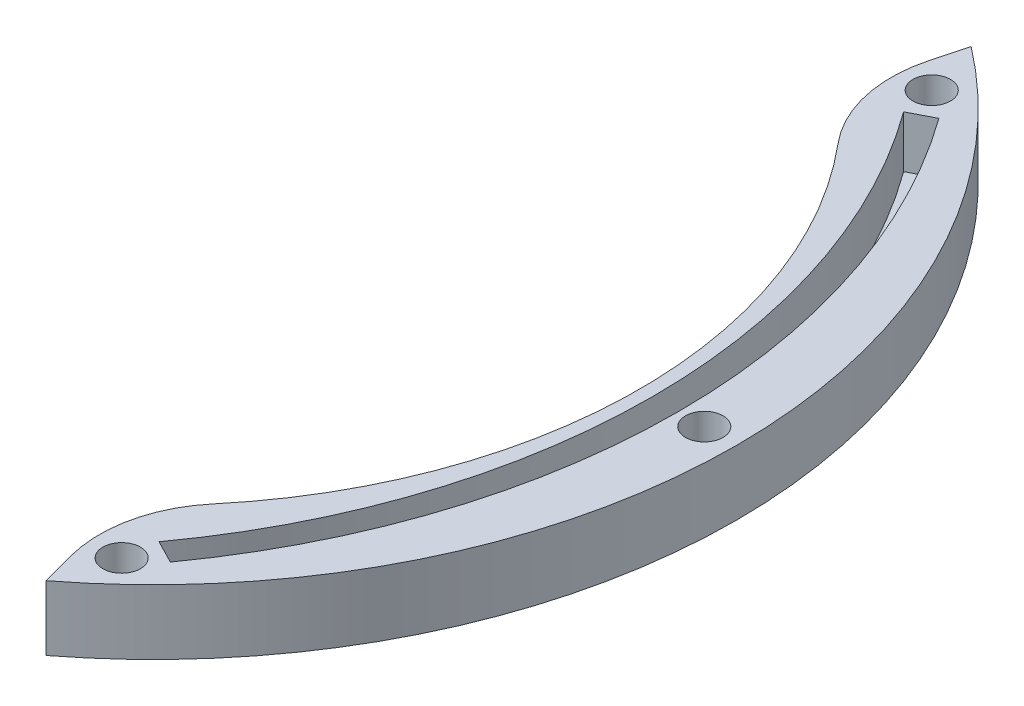
ISO-10303-21;
HEADER;
FILE_DESCRIPTION(('STEP AP214'),'2;1');
FILE_NAME('part.step','',(''),(''),'','','');
FILE_SCHEMA(('AUTOMOTIVE_DESIGN { 1 0 10303 214 1 1 1 1 }'));
ENDSEC;
DATA;
#1=APPLICATION_CONTEXT('core data for automotive mechanical design processes');
#2=APPLICATION_PROTOCOL_DEFINITION('international standard','automotive_design',2000,#1);
#3=PRODUCT_CONTEXT('',#1,'mechanical');
#4=PRODUCT('Part','Part','',(#3));
#5=PRODUCT_RELATED_PRODUCT_CATEGORY('part','',(#4));
#6=PRODUCT_DEFINITION_FORMATION('','',#4);
#7=PRODUCT_DEFINITION_CONTEXT('part definition',#1,'design');
#8=PRODUCT_DEFINITION('design','',#6,#7);
#9=PRODUCT_DEFINITION_SHAPE('','',#8);
#10=(LENGTH_UNIT() NAMED_UNIT(*) SI_UNIT(.MILLI.,.METRE.));
#11=(NAMED_UNIT(*) PLANE_ANGLE_UNIT() SI_UNIT($,.RADIAN.));
#12=(NAMED_UNIT(*) SI_UNIT($,.STERADIAN.) SOLID_ANGLE_UNIT());
#13=UNCERTAINTY_MEASURE_WITH_UNIT(LENGTH_MEASURE(1.E-05),#10,'distance_accuracy_value','');
#14=(GEOMETRIC_REPRESENTATION_CONTEXT(3) GLOBAL_UNCERTAINTY_ASSIGNED_CONTEXT((#13)) GLOBAL_UNIT_ASSIGNED_CONTEXT((#10,
#11,#12)) REPRESENTATION_CONTEXT('',''));
#15=CARTESIAN_POINT('',(0.,0.,0.));
#16=DIRECTION('',(0.,0.,1.));
#17=DIRECTION('',(1.,0.,0.));
#18=AXIS2_PLACEMENT_3D('',#15,#16,#17);
#19=CARTESIAN_POINT('',(0.,5.,0.));
#20=DIRECTION('',(0.,-1.,0.));
#21=DIRECTION('',(0.,0.,-1.));
#22=AXIS2_PLACEMENT_3D('',#19,#20,#21);
#23=CYLINDRICAL_SURFACE('',#22,45.);
#24=CARTESIAN_POINT('',(0.,0.,0.));
#25=DIRECTION('',(0.,1.,0.));
#26=DIRECTION('',(0.,0.,-1.));
#27=AXIS2_PLACEMENT_3D('',#24,#25,#26);
#28=CIRCLE('',#27,45.);
#29=CARTESIAN_POINT('',(27.3954375763557,0.,35.7));
#30=VERTEX_POINT('',#29);
#31=CARTESIAN_POINT('',(27.3954375763557,0.,-35.7));
#32=VERTEX_POINT('',#31);
#33=EDGE_CURVE('E164',#30,#32,#28,.T.);
#34=ORIENTED_EDGE('',*,*,#33,.T.);
#35=DIRECTION('',(0.,-1.,0.));
#36=VECTOR('',#35,1.);
#37=CARTESIAN_POINT('',(27.3954375763557,5.,-35.7));
#38=LINE('',#37,#36);
#39=CARTESIAN_POINT('',(27.3954375763557,5.,-35.7));
#40=VERTEX_POINT('',#39);
#41=EDGE_CURVE('E199',#40,#32,#38,.T.);
#42=ORIENTED_EDGE('',*,*,#41,.F.);
#43=CARTESIAN_POINT('',(0.,5.,0.));
#44=DIRECTION('',(0.,1.,0.));
#45=DIRECTION('',(0.,0.,-1.));
#46=AXIS2_PLACEMENT_3D('',#43,#44,#45);
#47=CIRCLE('',#46,45.);
#48=CARTESIAN_POINT('',(27.3954375763557,5.,35.7));
#49=VERTEX_POINT('',#48);
#50=EDGE_CURVE('E179',#49,#40,#47,.T.);
#51=ORIENTED_EDGE('',*,*,#50,.F.);
#52=DIRECTION('',(0.,-1.,0.));
#53=VECTOR('',#52,1.);
#54=CARTESIAN_POINT('',(27.3954375763557,5.,35.7));
#55=LINE('',#54,#53);
#56=EDGE_CURVE('E189',#49,#30,#55,.T.);
#57=ORIENTED_EDGE('',*,*,#56,.T.);
#58=EDGE_LOOP('',(#34,#42,#51,#57));
#59=FACE_BOUND('',#58,.T.);
#60=ADVANCED_FACE('F40',(#59),#23,.T.);
#61=CARTESIAN_POINT('',(25.2569128106269,5.,-27.7189169210558));
#62=DIRECTION('',(0.965925826289069,0.,0.258819045102518));
#63=DIRECTION('',(0.258819045102518,0.,-0.965925826289069));
#64=AXIS2_PLACEMENT_3D('',#61,#62,#63);
#65=PLANE('',#64);
#66=DIRECTION('',(-0.258819045102518,0.,0.965925826289069));
#67=VECTOR('',#66,1.);
#68=CARTESIAN_POINT('',(25.2569128106269,0.,-27.7189169210558));
#69=LINE('',#68,#67);
#70=CARTESIAN_POINT('',(26.7099905064169,0.,-33.1418767090893));
#71=VERTEX_POINT('',#70);
#72=EDGE_CURVE('E192',#32,#71,#69,.T.);
#73=ORIENTED_EDGE('',*,*,#72,.T.);
#74=DIRECTION('',(0.,-1.,0.));
#75=VECTOR('',#74,1.);
#76=CARTESIAN_POINT('',(26.7099905064169,5.,-33.1418767090893));
#77=LINE('',#76,#75);
#78=CARTESIAN_POINT('',(26.7099905064169,5.,-33.1418767090893));
#79=VERTEX_POINT('',#78);
#80=EDGE_CURVE('E11',#71,#79,#77,.F.);
#81=ORIENTED_EDGE('',*,*,#80,.T.);
#82=DIRECTION('',(-0.258819045102518,0.,0.965925826289069));
#83=VECTOR('',#82,1.);
#84=CARTESIAN_POINT('',(25.2569128106269,5.,-27.7189169210558));
#85=LINE('',#84,#83);
#86=EDGE_CURVE('E182',#40,#79,#85,.T.);
#87=ORIENTED_EDGE('',*,*,#86,.F.);
#88=ORIENTED_EDGE('',*,*,#41,.T.);
#89=EDGE_LOOP('',(#73,#81,#87,#88));
#90=FACE_BOUND('',#89,.T.);
#91=ADVANCED_FACE('F234',(#90),#65,.F.);
#92=CARTESIAN_POINT('',(0.,5.,0.));
#93=DIRECTION('',(0.,-1.,0.));
#94=DIRECTION('',(0.,0.,-1.));
#95=AXIS2_PLACEMENT_3D('',#92,#93,#94);
#96=CYLINDRICAL_SURFACE('',#95,37.5);
#97=CARTESIAN_POINT('',(0.,0.,0.));
#98=DIRECTION('',(0.,-1.,0.));
#99=DIRECTION('',(0.,0.,-1.));
#100=AXIS2_PLACEMENT_3D('',#97,#98,#99);
#101=CIRCLE('',#100,37.5);
#102=CARTESIAN_POINT('',(28.7125648178744,0.,-24.1213312563664));
#103=VERTEX_POINT('',#102);
#104=CARTESIAN_POINT('',(28.7125648178744,0.,24.1213312563664));
#105=VERTEX_POINT('',#104);
#106=EDGE_CURVE('E194',#103,#105,#101,.T.);
#107=ORIENTED_EDGE('',*,*,#106,.T.);
#108=DIRECTION('',(0.,-1.,0.));
#109=VECTOR('',#108,1.);
#110=CARTESIAN_POINT('',(28.7125648178744,5.,24.1213312563664));
#111=LINE('',#110,#109);
#112=CARTESIAN_POINT('',(28.7125648178744,5.,24.1213312563664));
#113=VERTEX_POINT('',#112);
#114=EDGE_CURVE('E61',#105,#113,#111,.F.);
#115=ORIENTED_EDGE('',*,*,#114,.T.);
#116=CARTESIAN_POINT('',(0.,5.,0.));
#117=DIRECTION('',(0.,-1.,0.));
#118=DIRECTION('',(0.,0.,-1.));
#119=AXIS2_PLACEMENT_3D('',#116,#117,#118);
#120=CIRCLE('',#119,37.5);
#121=CARTESIAN_POINT('',(28.7125648178744,5.,-24.1213312563664));
#122=VERTEX_POINT('',#121);
#123=EDGE_CURVE('E185',#122,#113,#120,.T.);
#124=ORIENTED_EDGE('',*,*,#123,.F.);
#125=DIRECTION('',(0.,-1.,0.));
#126=VECTOR('',#125,1.);
#127=CARTESIAN_POINT('',(28.7125648178744,5.,-24.1213312563664));
#128=LINE('',#127,#126);
#129=EDGE_CURVE('E209',#122,#103,#128,.T.);
#130=ORIENTED_EDGE('',*,*,#129,.T.);
#131=EDGE_LOOP('',(#107,#115,#124,#130));
#132=FACE_BOUND('',#131,.T.);
#133=ADVANCED_FACE('F230',(#132),#96,.F.);
#134=CARTESIAN_POINT('',(27.3954375763557,5.,35.7));
#135=DIRECTION('',(0.965925826289069,0.,-0.258819045102518));
#136=DIRECTION('',(-0.258819045102518,0.,-0.965925826289069));
#137=AXIS2_PLACEMENT_3D('',#134,#135,#136);
#138=PLANE('',#137);
#139=DIRECTION('',(0.258819045102518,0.,0.965925826289069));
#140=VECTOR('',#139,1.);
#141=CARTESIAN_POINT('',(27.3954375763557,5.,35.7));
#142=LINE('',#141,#140);
#143=CARTESIAN_POINT('',(26.7099905064169,5.,33.1418767090893));
#144=VERTEX_POINT('',#143);
#145=EDGE_CURVE('E187',#144,#49,#142,.T.);
#146=ORIENTED_EDGE('',*,*,#145,.F.);
#147=DIRECTION('',(0.,-1.,0.));
#148=VECTOR('',#147,1.);
#149=CARTESIAN_POINT('',(26.7099905064169,5.,33.1418767090893));
#150=LINE('',#149,#148);
#151=CARTESIAN_POINT('',(26.7099905064169,0.,33.1418767090893));
#152=VERTEX_POINT('',#151);
#153=EDGE_CURVE('E202',#144,#152,#150,.T.);
#154=ORIENTED_EDGE('',*,*,#153,.T.);
#155=DIRECTION('',(0.258819045102518,0.,0.965925826289069));
#156=VECTOR('',#155,1.);
#157=CARTESIAN_POINT('',(27.3954375763557,0.,35.7));
#158=LINE('',#157,#156);
#159=EDGE_CURVE('E183',#152,#30,#158,.T.);
#160=ORIENTED_EDGE('',*,*,#159,.T.);
#161=ORIENTED_EDGE('',*,*,#56,.F.);
#162=EDGE_LOOP('',(#146,#154,#160,#161));
#163=FACE_BOUND('',#162,.T.);
#164=ADVANCED_FACE('F222',(#163),#138,.F.);
#165=CARTESIAN_POINT('',(0.,5.,0.));
#166=DIRECTION('',(0.,-1.,0.));
#167=DIRECTION('',(0.,0.,-1.));
#168=AXIS2_PLACEMENT_3D('',#165,#166,#167);
#169=PLANE('',#168);
#170=DIRECTION('',(0.889788358318186,0.,0.456373396903706));
#171=VECTOR('',#170,1.);
#172=CARTESIAN_POINT('',(29.1523991042336,5.,28.7341081209373));
#173=LINE('',#172,#171);
#174=CARTESIAN_POINT('',(29.1523991042336,5.,28.7341081209373));
#175=VERTEX_POINT('',#174);
#176=CARTESIAN_POINT('',(30.9527362807552,5.,29.6575029767366));
#177=VERTEX_POINT('',#176);
#178=EDGE_CURVE('E151',#175,#177,#173,.T.);
#179=ORIENTED_EDGE('',*,*,#178,.F.);
#180=CARTESIAN_POINT('',(-10.3374802224702,5.,1.11823851350236E-06));
#181=DIRECTION('',(0.,-1.,0.));
#182=DIRECTION('',(0.,0.,-1.));
#183=AXIS2_PLACEMENT_3D('',#180,#181,#182);
#184=CIRCLE('',#183,48.8374802224702);
#185=CARTESIAN_POINT('',(29.1523979191704,5.,-28.7341075131171));
#186=VERTEX_POINT('',#185);
#187=EDGE_CURVE('E125',#186,#175,#184,.T.);
#188=ORIENTED_EDGE('',*,*,#187,.F.);
#189=DIRECTION('',(-0.889788358318186,0.,0.456373396903706));
#190=VECTOR('',#189,1.);
#191=CARTESIAN_POINT('',(29.1523979191704,5.,-28.7341075131171));
#192=LINE('',#191,#190);
#193=CARTESIAN_POINT('',(30.9527351068354,5.,-29.6575023746319));
#194=VERTEX_POINT('',#193);
#195=EDGE_CURVE('E142',#194,#186,#192,.T.);
#196=ORIENTED_EDGE('',*,*,#195,.F.);
#197=CARTESIAN_POINT('',(-10.3374802224702,5.,1.11823851350236E-06));
#198=DIRECTION('',(0.,1.,0.));
#199=DIRECTION('',(0.,0.,1.));
#200=AXIS2_PLACEMENT_3D('',#197,#198,#199);
#201=CIRCLE('',#200,50.8374802224702);
#202=EDGE_CURVE('E145',#177,#194,#201,.T.);
#203=ORIENTED_EDGE('',*,*,#202,.F.);
#204=EDGE_LOOP('',(#179,#188,#196,#203));
#205=FACE_BOUND('',#204,.T.);
#206=CARTESIAN_POINT('',(42.5,5.,0.));
#207=DIRECTION('',(0.,1.,0.));
#208=DIRECTION('',(0.,0.,1.));
#209=AXIS2_PLACEMENT_3D('',#206,#207,#208);
#210=CIRCLE('',#209,1.45);
#211=CARTESIAN_POINT('',(42.5,5.,1.45));
#212=VERTEX_POINT('',#211);
#213=EDGE_CURVE('E165',#212,#212,#210,.T.);
#214=ORIENTED_EDGE('',*,*,#213,.F.);
#215=EDGE_LOOP('',(#214));
#216=FACE_BOUND('',#215,.T.);
#217=CARTESIAN_POINT('',(28.7938366328269,5.,-31.2596380651164));
#218=DIRECTION('',(0.,1.,0.));
#219=DIRECTION('',(0.,0.,1.));
#220=AXIS2_PLACEMENT_3D('',#217,#218,#219);
#221=CIRCLE('',#220,1.45);
#222=CARTESIAN_POINT('',(28.7938366328269,5.,-29.8096380651164));
#223=VERTEX_POINT('',#222);
#224=EDGE_CURVE('E168',#223,#223,#221,.T.);
#225=ORIENTED_EDGE('',*,*,#224,.F.);
#226=EDGE_LOOP('',(#225));
#227=FACE_BOUND('',#226,.T.);
#228=CARTESIAN_POINT('',(28.7938366328269,5.,31.2596380651164));
#229=DIRECTION('',(0.,1.,0.));
#230=DIRECTION('',(0.,0.,-1.));
#231=AXIS2_PLACEMENT_3D('',#228,#229,#230);
#232=CIRCLE('',#231,1.45);
#233=CARTESIAN_POINT('',(28.7938366328269,5.,29.8096380651164));
#234=VERTEX_POINT('',#233);
#235=EDGE_CURVE('E174',#234,#234,#232,.T.);
#236=ORIENTED_EDGE('',*,*,#235,.F.);
#237=EDGE_LOOP('',(#236));
#238=FACE_BOUND('',#237,.T.);
#239=ORIENTED_EDGE('',*,*,#123,.T.);
#240=CARTESIAN_POINT('',(36.3692487693076,5.,30.5536862580641));
#241=DIRECTION('',(0.,-1.,0.));
#242=DIRECTION('',(0.,0.,-1.));
#243=AXIS2_PLACEMENT_3D('',#240,#241,#242);
#244=CIRCLE('',#243,10.);
#245=EDGE_CURVE('E48',#113,#144,#244,.F.);
#246=ORIENTED_EDGE('',*,*,#245,.T.);
#247=ORIENTED_EDGE('',*,*,#145,.T.);
#248=ORIENTED_EDGE('',*,*,#50,.T.);
#249=ORIENTED_EDGE('',*,*,#86,.T.);
#250=CARTESIAN_POINT('',(36.3692487693076,5.,-30.5536862580641));
#251=DIRECTION('',(0.,-1.,0.));
#252=DIRECTION('',(0.,0.,-1.));
#253=AXIS2_PLACEMENT_3D('',#250,#251,#252);
#254=CIRCLE('',#253,10.);
#255=EDGE_CURVE('E213',#79,#122,#254,.F.);
#256=ORIENTED_EDGE('',*,*,#255,.T.);
#257=EDGE_LOOP('',(#239,#246,#247,#248,#249,#256));
#258=FACE_BOUND('',#257,.T.);
#259=ADVANCED_FACE('F217',(#205,#216,#227,#238,#258),#169,.F.);
#260=CARTESIAN_POINT('',(0.,0.,0.));
#261=DIRECTION('',(0.,-1.,0.));
#262=DIRECTION('',(0.,0.,-1.));
#263=AXIS2_PLACEMENT_3D('',#260,#261,#262);
#264=PLANE('',#263);
#265=CARTESIAN_POINT('',(42.5,0.,0.));
#266=DIRECTION('',(0.,1.,0.));
#267=DIRECTION('',(0.,0.,1.));
#268=AXIS2_PLACEMENT_3D('',#265,#266,#267);
#269=CIRCLE('',#268,1.45);
#270=CARTESIAN_POINT('',(42.5,0.,1.45));
#271=VERTEX_POINT('',#270);
#272=EDGE_CURVE('E161',#271,#271,#269,.T.);
#273=ORIENTED_EDGE('',*,*,#272,.T.);
#274=EDGE_LOOP('',(#273));
#275=FACE_BOUND('',#274,.T.);
#276=CARTESIAN_POINT('',(28.7938366328269,0.,-31.2596380651164));
#277=DIRECTION('',(0.,1.,0.));
#278=DIRECTION('',(0.,0.,1.));
#279=AXIS2_PLACEMENT_3D('',#276,#277,#278);
#280=CIRCLE('',#279,1.45);
#281=CARTESIAN_POINT('',(28.7938366328269,0.,-29.8096380651164));
#282=VERTEX_POINT('',#281);
#283=EDGE_CURVE('E171',#282,#282,#280,.T.);
#284=ORIENTED_EDGE('',*,*,#283,.T.);
#285=EDGE_LOOP('',(#284));
#286=FACE_BOUND('',#285,.T.);
#287=CARTESIAN_POINT('',(28.7938366328269,0.,31.2596380651164));
#288=DIRECTION('',(0.,1.,0.));
#289=DIRECTION('',(0.,0.,-1.));
#290=AXIS2_PLACEMENT_3D('',#287,#288,#289);
#291=CIRCLE('',#290,1.45);
#292=CARTESIAN_POINT('',(28.7938366328269,0.,29.8096380651164));
#293=VERTEX_POINT('',#292);
#294=EDGE_CURVE('E157',#293,#293,#291,.T.);
#295=ORIENTED_EDGE('',*,*,#294,.T.);
#296=EDGE_LOOP('',(#295));
#297=FACE_BOUND('',#296,.T.);
#298=ORIENTED_EDGE('',*,*,#159,.F.);
#299=CARTESIAN_POINT('',(36.3692487693076,0.,30.5536862580641));
#300=DIRECTION('',(0.,-1.,0.));
#301=DIRECTION('',(0.,0.,-1.));
#302=AXIS2_PLACEMENT_3D('',#299,#300,#301);
#303=CIRCLE('',#302,10.);
#304=EDGE_CURVE('E207',#152,#105,#303,.T.);
#305=ORIENTED_EDGE('',*,*,#304,.T.);
#306=ORIENTED_EDGE('',*,*,#106,.F.);
#307=CARTESIAN_POINT('',(36.3692487693076,0.,-30.5536862580641));
#308=DIRECTION('',(0.,-1.,0.));
#309=DIRECTION('',(0.,0.,-1.));
#310=AXIS2_PLACEMENT_3D('',#307,#308,#309);
#311=CIRCLE('',#310,10.);
#312=EDGE_CURVE('E205',#103,#71,#311,.T.);
#313=ORIENTED_EDGE('',*,*,#312,.T.);
#314=ORIENTED_EDGE('',*,*,#72,.F.);
#315=ORIENTED_EDGE('',*,*,#33,.F.);
#316=EDGE_LOOP('',(#298,#305,#306,#313,#314,#315));
#317=FACE_BOUND('',#316,.T.);
#318=ADVANCED_FACE('F228',(#275,#286,#297,#317),#264,.T.);
#319=CARTESIAN_POINT('',(28.7938366328269,0.,31.2596380651164));
#320=DIRECTION('',(0.,1.,0.));
#321=DIRECTION('',(0.,0.,1.));
#322=AXIS2_PLACEMENT_3D('',#319,#320,#321);
#323=CYLINDRICAL_SURFACE('',#322,1.45);
#324=ORIENTED_EDGE('',*,*,#294,.F.);
#325=EDGE_LOOP('',(#324));
#326=FACE_BOUND('',#325,.T.);
#327=ORIENTED_EDGE('',*,*,#235,.T.);
#328=EDGE_LOOP('',(#327));
#329=FACE_BOUND('',#328,.T.);
#330=ADVANCED_FACE('F274',(#326,#329),#323,.F.);
#331=CARTESIAN_POINT('',(28.7938366328269,0.,-31.2596380651164));
#332=DIRECTION('',(0.,1.,0.));
#333=DIRECTION('',(0.,0.,1.));
#334=AXIS2_PLACEMENT_3D('',#331,#332,#333);
#335=CYLINDRICAL_SURFACE('',#334,1.45);
#336=ORIENTED_EDGE('',*,*,#283,.F.);
#337=EDGE_LOOP('',(#336));
#338=FACE_BOUND('',#337,.T.);
#339=ORIENTED_EDGE('',*,*,#224,.T.);
#340=EDGE_LOOP('',(#339));
#341=FACE_BOUND('',#340,.T.);
#342=ADVANCED_FACE('F270',(#338,#341),#335,.F.);
#343=CARTESIAN_POINT('',(42.5,0.,0.));
#344=DIRECTION('',(0.,1.,0.));
#345=DIRECTION('',(0.,0.,1.));
#346=AXIS2_PLACEMENT_3D('',#343,#344,#345);
#347=CYLINDRICAL_SURFACE('',#346,1.45);
#348=ORIENTED_EDGE('',*,*,#272,.F.);
#349=EDGE_LOOP('',(#348));
#350=FACE_BOUND('',#349,.T.);
#351=ORIENTED_EDGE('',*,*,#213,.T.);
#352=EDGE_LOOP('',(#351));
#353=FACE_BOUND('',#352,.T.);
#354=ADVANCED_FACE('F267',(#350,#353),#347,.F.);
#355=CARTESIAN_POINT('',(-10.3374802224702,1.,1.11823851350236E-06));
#356=DIRECTION('',(0.,1.,0.));
#357=DIRECTION('',(0.,0.,1.));
#358=AXIS2_PLACEMENT_3D('',#355,#356,#357);
#359=CYLINDRICAL_SURFACE('',#358,48.8374802224702);
#360=ORIENTED_EDGE('',*,*,#187,.T.);
#361=DIRECTION('',(0.,1.,0.));
#362=VECTOR('',#361,1.);
#363=CARTESIAN_POINT('',(29.1523991042336,1.,28.7341081209373));
#364=LINE('',#363,#362);
#365=CARTESIAN_POINT('',(29.1523991042336,1.,28.7341081209373));
#366=VERTEX_POINT('',#365);
#367=EDGE_CURVE('E118',#366,#175,#364,.T.);
#368=ORIENTED_EDGE('',*,*,#367,.F.);
#369=CARTESIAN_POINT('',(-10.3374802224702,1.,1.11823851350236E-06));
#370=DIRECTION('',(0.,-1.,0.));
#371=DIRECTION('',(0.,0.,-1.));
#372=AXIS2_PLACEMENT_3D('',#369,#370,#371);
#373=CIRCLE('',#372,48.8374802224702);
#374=CARTESIAN_POINT('',(29.1523979191704,1.,-28.7341075131171));
#375=VERTEX_POINT('',#374);
#376=EDGE_CURVE('E122',#375,#366,#373,.T.);
#377=ORIENTED_EDGE('',*,*,#376,.F.);
#378=DIRECTION('',(0.,1.,0.));
#379=VECTOR('',#378,1.);
#380=CARTESIAN_POINT('',(29.1523979191704,1.,-28.7341075131171));
#381=LINE('',#380,#379);
#382=EDGE_CURVE('E155',#375,#186,#381,.T.);
#383=ORIENTED_EDGE('',*,*,#382,.T.);
#384=EDGE_LOOP('',(#360,#368,#377,#383));
#385=FACE_BOUND('',#384,.T.);
#386=ADVANCED_FACE('F120',(#385),#359,.T.);
#387=CARTESIAN_POINT('',(29.1523979191704,1.,-28.7341075131171));
#388=DIRECTION('',(-0.456373396903706,0.,-0.889788358318186));
#389=DIRECTION('',(-0.889788358318186,0.,0.456373396903706));
#390=AXIS2_PLACEMENT_3D('',#387,#388,#389);
#391=PLANE('',#390);
#392=ORIENTED_EDGE('',*,*,#195,.T.);
#393=ORIENTED_EDGE('',*,*,#382,.F.);
#394=DIRECTION('',(-0.889788358318186,0.,0.456373396903706));
#395=VECTOR('',#394,1.);
#396=CARTESIAN_POINT('',(29.1523979191704,1.,-28.7341075131171));
#397=LINE('',#396,#395);
#398=CARTESIAN_POINT('',(30.9527351068354,1.,-29.6575023746319));
#399=VERTEX_POINT('',#398);
#400=EDGE_CURVE('E130',#399,#375,#397,.T.);
#401=ORIENTED_EDGE('',*,*,#400,.F.);
#402=DIRECTION('',(0.,1.,0.));
#403=VECTOR('',#402,1.);
#404=CARTESIAN_POINT('',(30.9527351068354,1.,-29.6575023746319));
#405=LINE('',#404,#403);
#406=EDGE_CURVE('E158',#399,#194,#405,.T.);
#407=ORIENTED_EDGE('',*,*,#406,.T.);
#408=EDGE_LOOP('',(#392,#393,#401,#407));
#409=FACE_BOUND('',#408,.T.);
#410=ADVANCED_FACE('F258',(#409),#391,.F.);
#411=CARTESIAN_POINT('',(-10.3374802224702,1.,1.11823851350236E-06));
#412=DIRECTION('',(0.,1.,0.));
#413=DIRECTION('',(0.,0.,1.));
#414=AXIS2_PLACEMENT_3D('',#411,#412,#413);
#415=CYLINDRICAL_SURFACE('',#414,50.8374802224702);
#416=ORIENTED_EDGE('',*,*,#202,.T.);
#417=ORIENTED_EDGE('',*,*,#406,.F.);
#418=CARTESIAN_POINT('',(-10.3374802224702,1.,1.11823851350236E-06));
#419=DIRECTION('',(0.,1.,0.));
#420=DIRECTION('',(0.,0.,1.));
#421=AXIS2_PLACEMENT_3D('',#418,#419,#420);
#422=CIRCLE('',#421,50.8374802224702);
#423=CARTESIAN_POINT('',(30.9527362807552,1.,29.6575029767366));
#424=VERTEX_POINT('',#423);
#425=EDGE_CURVE('E138',#424,#399,#422,.T.);
#426=ORIENTED_EDGE('',*,*,#425,.F.);
#427=DIRECTION('',(0.,1.,0.));
#428=VECTOR('',#427,1.);
#429=CARTESIAN_POINT('',(30.9527362807552,1.,29.6575029767366));
#430=LINE('',#429,#428);
#431=EDGE_CURVE('E129',#424,#177,#430,.T.);
#432=ORIENTED_EDGE('',*,*,#431,.T.);
#433=EDGE_LOOP('',(#416,#417,#426,#432));
#434=FACE_BOUND('',#433,.T.);
#435=ADVANCED_FACE('F255',(#434),#415,.F.);
#436=CARTESIAN_POINT('',(29.1523991042336,1.,28.7341081209373));
#437=DIRECTION('',(-0.456373396903706,0.,0.889788358318186));
#438=DIRECTION('',(0.889788358318186,0.,0.456373396903706));
#439=AXIS2_PLACEMENT_3D('',#436,#437,#438);
#440=PLANE('',#439);
#441=ORIENTED_EDGE('',*,*,#178,.T.);
#442=ORIENTED_EDGE('',*,*,#431,.F.);
#443=DIRECTION('',(0.889788358318186,0.,0.456373396903706));
#444=VECTOR('',#443,1.);
#445=CARTESIAN_POINT('',(29.1523991042336,1.,28.7341081209373));
#446=LINE('',#445,#444);
#447=EDGE_CURVE('E133',#366,#424,#446,.T.);
#448=ORIENTED_EDGE('',*,*,#447,.F.);
#449=ORIENTED_EDGE('',*,*,#367,.T.);
#450=EDGE_LOOP('',(#441,#442,#448,#449));
#451=FACE_BOUND('',#450,.T.);
#452=ADVANCED_FACE('F134',(#451),#440,.F.);
#453=CARTESIAN_POINT('',(-10.3374802224702,1.,1.11823851350236E-06));
#454=DIRECTION('',(0.,-1.,0.));
#455=DIRECTION('',(0.,0.,-1.));
#456=AXIS2_PLACEMENT_3D('',#453,#454,#455);
#457=PLANE('',#456);
#458=ORIENTED_EDGE('',*,*,#376,.T.);
#459=ORIENTED_EDGE('',*,*,#447,.T.);
#460=ORIENTED_EDGE('',*,*,#425,.T.);
#461=ORIENTED_EDGE('',*,*,#400,.T.);
#462=EDGE_LOOP('',(#458,#459,#460,#461));
#463=FACE_BOUND('',#462,.T.);
#464=ADVANCED_FACE('F140',(#463),#457,.F.);
#465=CARTESIAN_POINT('',(36.3692487693076,5.,30.5536862580641));
#466=DIRECTION('',(0.,-1.,0.));
#467=DIRECTION('',(0.,0.,-1.));
#468=AXIS2_PLACEMENT_3D('',#465,#466,#467);
#469=CYLINDRICAL_SURFACE('',#468,10.);
#470=ORIENTED_EDGE('',*,*,#245,.F.);
#471=ORIENTED_EDGE('',*,*,#114,.F.);
#472=ORIENTED_EDGE('',*,*,#304,.F.);
#473=ORIENTED_EDGE('',*,*,#153,.F.);
#474=EDGE_LOOP('',(#470,#471,#472,#473));
#475=FACE_BOUND('',#474,.T.);
#476=ADVANCED_FACE('F225',(#475),#469,.T.);
#477=CARTESIAN_POINT('',(36.3692487693076,5.,-30.5536862580641));
#478=DIRECTION('',(0.,-1.,0.));
#479=DIRECTION('',(0.,0.,-1.));
#480=AXIS2_PLACEMENT_3D('',#477,#478,#479);
#481=CYLINDRICAL_SURFACE('',#480,10.);
#482=ORIENTED_EDGE('',*,*,#255,.F.);
#483=ORIENTED_EDGE('',*,*,#80,.F.);
#484=ORIENTED_EDGE('',*,*,#312,.F.);
#485=ORIENTED_EDGE('',*,*,#129,.F.);
#486=EDGE_LOOP('',(#482,#483,#484,#485));
#487=FACE_BOUND('',#486,.T.);
#488=ADVANCED_FACE('F42',(#487),#481,.T.);
#489=CLOSED_SHELL('',(#60,#91,#133,#164,#259,#318,#330,#342,#354,#386,#410,#435,#452,#464,#476,#488));
#490=MANIFOLD_SOLID_BREP('B2',#489);
#491=ADVANCED_BREP_SHAPE_REPRESENTATION('',(#18,#490),#14);
#492=SHAPE_DEFINITION_REPRESENTATION(#9,#491);
ENDSEC;
END-ISO-10303-21;
